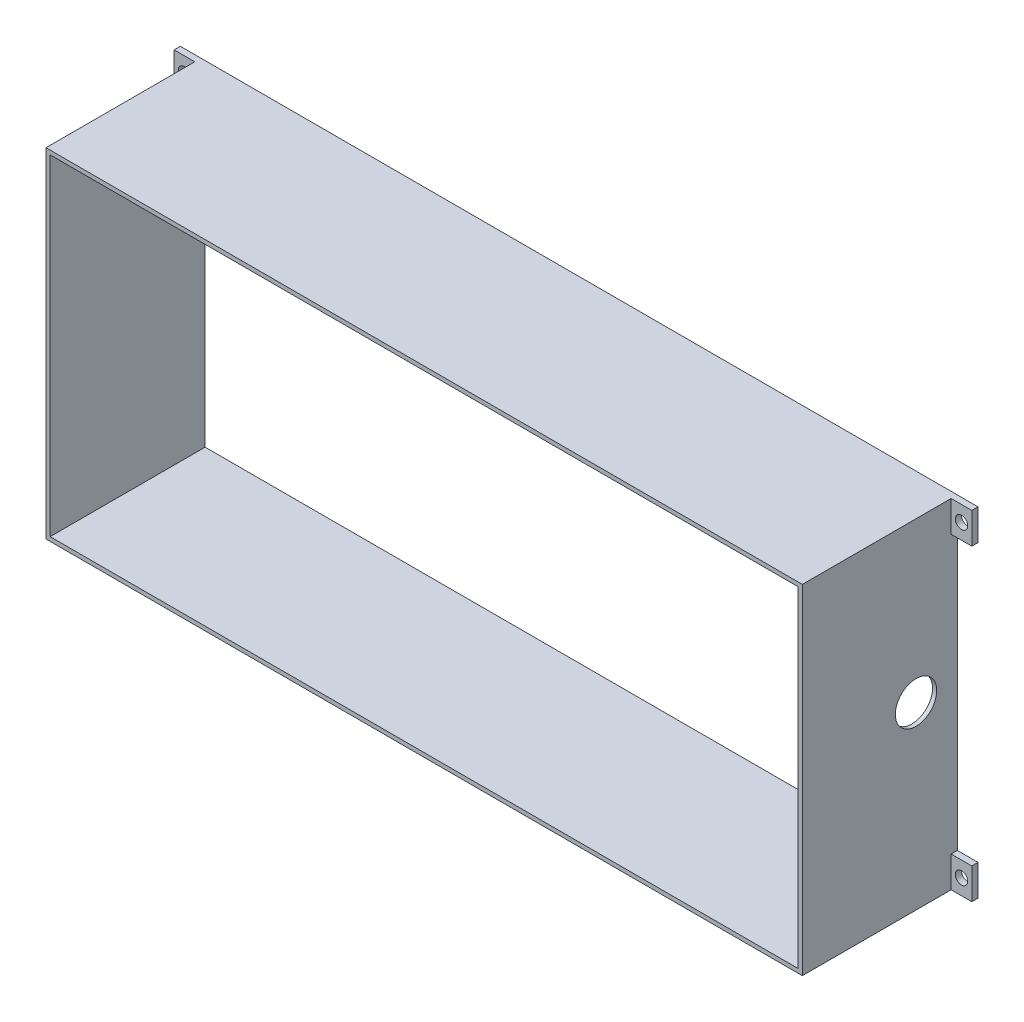
ISO-10303-21;
HEADER;
FILE_DESCRIPTION(('STEP AP214'),'2;1');
FILE_NAME('part.step','',(''),(''),'','','');
FILE_SCHEMA(('AUTOMOTIVE_DESIGN { 1 0 10303 214 1 1 1 1 }'));
ENDSEC;
DATA;
#1=APPLICATION_CONTEXT('core data for automotive mechanical design processes');
#2=APPLICATION_PROTOCOL_DEFINITION('international standard','automotive_design',2000,#1);
#3=PRODUCT_CONTEXT('',#1,'mechanical');
#4=PRODUCT('Part','Part','',(#3));
#5=PRODUCT_RELATED_PRODUCT_CATEGORY('part','',(#4));
#6=PRODUCT_DEFINITION_FORMATION('','',#4);
#7=PRODUCT_DEFINITION_CONTEXT('part definition',#1,'design');
#8=PRODUCT_DEFINITION('design','',#6,#7);
#9=PRODUCT_DEFINITION_SHAPE('','',#8);
#10=(LENGTH_UNIT() NAMED_UNIT(*) SI_UNIT(.MILLI.,.METRE.));
#11=(NAMED_UNIT(*) PLANE_ANGLE_UNIT() SI_UNIT($,.RADIAN.));
#12=(NAMED_UNIT(*) SI_UNIT($,.STERADIAN.) SOLID_ANGLE_UNIT());
#13=UNCERTAINTY_MEASURE_WITH_UNIT(LENGTH_MEASURE(1.E-05),#10,'distance_accuracy_value','');
#14=(GEOMETRIC_REPRESENTATION_CONTEXT(3) GLOBAL_UNCERTAINTY_ASSIGNED_CONTEXT((#13)) GLOBAL_UNIT_ASSIGNED_CONTEXT((#10,
#11,#12)) REPRESENTATION_CONTEXT('',''));
#15=CARTESIAN_POINT('',(0.,0.,0.));
#16=DIRECTION('',(0.,0.,1.));
#17=DIRECTION('',(1.,0.,0.));
#18=AXIS2_PLACEMENT_3D('',#15,#16,#17);
#19=CARTESIAN_POINT('',(183.,82.,75.));
#20=DIRECTION('',(-1.,0.,0.));
#21=DIRECTION('',(0.,-1.,0.));
#22=AXIS2_PLACEMENT_3D('',#19,#20,#21);
#23=PLANE('',#22);
#24=CARTESIAN_POINT('',(183.,5.00000000000004,20.));
#25=DIRECTION('',(1.,0.,0.));
#26=DIRECTION('',(0.,1.,0.));
#27=AXIS2_PLACEMENT_3D('',#24,#25,#26);
#28=CIRCLE('',#27,10.);
#29=CARTESIAN_POINT('',(183.,15.,20.));
#30=VERTEX_POINT('',#29);
#31=EDGE_CURVE('E394',#30,#30,#28,.T.);
#32=ORIENTED_EDGE('',*,*,#31,.F.);
#33=EDGE_LOOP('',(#32));
#34=FACE_BOUND('',#33,.T.);
#35=DIRECTION('',(0.,0.,1.));
#36=VECTOR('',#35,1.);
#37=CARTESIAN_POINT('',(183.,-67.,0.));
#38=LINE('',#37,#36);
#39=CARTESIAN_POINT('',(183.,-67.,0.));
#40=VERTEX_POINT('',#39);
#41=CARTESIAN_POINT('',(183.,-67.,3.00000000000001));
#42=VERTEX_POINT('',#41);
#43=EDGE_CURVE('E239',#40,#42,#38,.T.);
#44=ORIENTED_EDGE('',*,*,#43,.F.);
#45=DIRECTION('',(0.,1.,0.));
#46=VECTOR('',#45,1.);
#47=CARTESIAN_POINT('',(183.,82.,0.));
#48=LINE('',#47,#46);
#49=CARTESIAN_POINT('',(183.,67.,0.));
#50=VERTEX_POINT('',#49);
#51=EDGE_CURVE('E313',#40,#50,#48,.T.);
#52=ORIENTED_EDGE('',*,*,#51,.T.);
#53=DIRECTION('',(0.,0.,-1.));
#54=VECTOR('',#53,1.);
#55=CARTESIAN_POINT('',(183.,67.,0.));
#56=LINE('',#55,#54);
#57=CARTESIAN_POINT('',(183.,67.,3.));
#58=VERTEX_POINT('',#57);
#59=EDGE_CURVE('E263',#58,#50,#56,.T.);
#60=ORIENTED_EDGE('',*,*,#59,.F.);
#61=DIRECTION('',(0.,-1.,0.));
#62=VECTOR('',#61,1.);
#63=CARTESIAN_POINT('',(183.,82.,3.));
#64=LINE('',#63,#62);
#65=CARTESIAN_POINT('',(183.,82.,3.));
#66=VERTEX_POINT('',#65);
#67=EDGE_CURVE('E258',#66,#58,#64,.T.);
#68=ORIENTED_EDGE('',*,*,#67,.F.);
#69=DIRECTION('',(0.,0.,-1.));
#70=VECTOR('',#69,1.);
#71=CARTESIAN_POINT('',(183.,82.,75.));
#72=LINE('',#71,#70);
#73=CARTESIAN_POINT('',(183.,82.,75.));
#74=VERTEX_POINT('',#73);
#75=EDGE_CURVE('E11',#74,#66,#72,.T.);
#76=ORIENTED_EDGE('',*,*,#75,.F.);
#77=DIRECTION('',(0.,1.,0.));
#78=VECTOR('',#77,1.);
#79=CARTESIAN_POINT('',(183.,82.,75.));
#80=LINE('',#79,#78);
#81=CARTESIAN_POINT('',(183.,-82.,75.));
#82=VERTEX_POINT('',#81);
#83=EDGE_CURVE('E185',#82,#74,#80,.T.);
#84=ORIENTED_EDGE('',*,*,#83,.F.);
#85=DIRECTION('',(0.,0.,-1.));
#86=VECTOR('',#85,1.);
#87=CARTESIAN_POINT('',(183.,-82.,75.));
#88=LINE('',#87,#86);
#89=CARTESIAN_POINT('',(183.,-82.,3.));
#90=VERTEX_POINT('',#89);
#91=EDGE_CURVE('E322',#82,#90,#88,.T.);
#92=ORIENTED_EDGE('',*,*,#91,.T.);
#93=DIRECTION('',(0.,-1.,0.));
#94=VECTOR('',#93,1.);
#95=CARTESIAN_POINT('',(183.,-82.,3.));
#96=LINE('',#95,#94);
#97=EDGE_CURVE('E56',#42,#90,#96,.T.);
#98=ORIENTED_EDGE('',*,*,#97,.F.);
#99=EDGE_LOOP('',(#44,#52,#60,#68,#76,#84,#92,#98));
#100=FACE_BOUND('',#99,.T.);
#101=ADVANCED_FACE('F33',(#34,#100),#23,.F.);
#102=CARTESIAN_POINT('',(0.,0.,75.));
#103=DIRECTION('',(0.,0.,1.));
#104=DIRECTION('',(1.,0.,0.));
#105=AXIS2_PLACEMENT_3D('',#102,#103,#104);
#106=PLANE('',#105);
#107=ORIENTED_EDGE('',*,*,#83,.T.);
#108=DIRECTION('',(-1.,0.,0.));
#109=VECTOR('',#108,1.);
#110=CARTESIAN_POINT('',(-183.,82.,75.));
#111=LINE('',#110,#109);
#112=CARTESIAN_POINT('',(-183.,82.,75.));
#113=VERTEX_POINT('',#112);
#114=EDGE_CURVE('E316',#74,#113,#111,.T.);
#115=ORIENTED_EDGE('',*,*,#114,.T.);
#116=DIRECTION('',(0.,-1.,0.));
#117=VECTOR('',#116,1.);
#118=CARTESIAN_POINT('',(-183.,82.,75.));
#119=LINE('',#118,#117);
#120=CARTESIAN_POINT('',(-183.,-82.,75.));
#121=VERTEX_POINT('',#120);
#122=EDGE_CURVE('E318',#113,#121,#119,.T.);
#123=ORIENTED_EDGE('',*,*,#122,.T.);
#124=DIRECTION('',(1.,0.,0.));
#125=VECTOR('',#124,1.);
#126=CARTESIAN_POINT('',(-183.,-82.,75.));
#127=LINE('',#126,#125);
#128=EDGE_CURVE('E320',#121,#82,#127,.T.);
#129=ORIENTED_EDGE('',*,*,#128,.T.);
#130=EDGE_LOOP('',(#107,#115,#123,#129));
#131=FACE_BOUND('',#130,.T.);
#132=DIRECTION('',(-1.,0.,0.));
#133=VECTOR('',#132,1.);
#134=CARTESIAN_POINT('',(-181.,80.,75.));
#135=LINE('',#134,#133);
#136=CARTESIAN_POINT('',(181.,80.,75.));
#137=VERTEX_POINT('',#136);
#138=CARTESIAN_POINT('',(-181.,80.,75.));
#139=VERTEX_POINT('',#138);
#140=EDGE_CURVE('E285',#137,#139,#135,.T.);
#141=ORIENTED_EDGE('',*,*,#140,.F.);
#142=DIRECTION('',(0.,1.,0.));
#143=VECTOR('',#142,1.);
#144=CARTESIAN_POINT('',(181.,80.,75.));
#145=LINE('',#144,#143);
#146=CARTESIAN_POINT('',(181.,-80.,75.));
#147=VERTEX_POINT('',#146);
#148=EDGE_CURVE('E283',#147,#137,#145,.T.);
#149=ORIENTED_EDGE('',*,*,#148,.F.);
#150=DIRECTION('',(1.,0.,0.));
#151=VECTOR('',#150,1.);
#152=CARTESIAN_POINT('',(-181.,-80.,75.));
#153=LINE('',#152,#151);
#154=CARTESIAN_POINT('',(-181.,-80.,75.));
#155=VERTEX_POINT('',#154);
#156=EDGE_CURVE('E291',#155,#147,#153,.T.);
#157=ORIENTED_EDGE('',*,*,#156,.F.);
#158=DIRECTION('',(0.,-1.,0.));
#159=VECTOR('',#158,1.);
#160=CARTESIAN_POINT('',(-181.,80.,75.));
#161=LINE('',#160,#159);
#162=EDGE_CURVE('E288',#139,#155,#161,.T.);
#163=ORIENTED_EDGE('',*,*,#162,.F.);
#164=EDGE_LOOP('',(#141,#149,#157,#163));
#165=FACE_BOUND('',#164,.T.);
#166=ADVANCED_FACE('F357',(#131,#165),#106,.T.);
#167=CARTESIAN_POINT('',(0.,0.,0.));
#168=DIRECTION('',(0.,0.,1.));
#169=DIRECTION('',(1.,0.,0.));
#170=AXIS2_PLACEMENT_3D('',#167,#168,#169);
#171=PLANE('',#170);
#172=CARTESIAN_POINT('',(-188.,74.5,0.));
#173=DIRECTION('',(0.,0.,1.));
#174=DIRECTION('',(1.,0.,0.));
#175=AXIS2_PLACEMENT_3D('',#172,#173,#174);
#176=CIRCLE('',#175,2.99999999999999);
#177=CARTESIAN_POINT('',(-185.,74.5,0.));
#178=VERTEX_POINT('',#177);
#179=EDGE_CURVE('E408',#178,#178,#176,.F.);
#180=ORIENTED_EDGE('',*,*,#179,.F.);
#181=EDGE_LOOP('',(#180));
#182=FACE_BOUND('',#181,.T.);
#183=CARTESIAN_POINT('',(-188.,-74.5,0.));
#184=DIRECTION('',(0.,0.,1.));
#185=DIRECTION('',(1.,0.,0.));
#186=AXIS2_PLACEMENT_3D('',#183,#184,#185);
#187=CIRCLE('',#186,2.99999999999999);
#188=CARTESIAN_POINT('',(-185.,-74.5,0.));
#189=VERTEX_POINT('',#188);
#190=EDGE_CURVE('E403',#189,#189,#187,.F.);
#191=ORIENTED_EDGE('',*,*,#190,.F.);
#192=EDGE_LOOP('',(#191));
#193=FACE_BOUND('',#192,.T.);
#194=CARTESIAN_POINT('',(188.,74.5,0.));
#195=DIRECTION('',(0.,0.,1.));
#196=DIRECTION('',(1.,0.,0.));
#197=AXIS2_PLACEMENT_3D('',#194,#195,#196);
#198=CIRCLE('',#197,2.99999999999999);
#199=CARTESIAN_POINT('',(191.,74.5,0.));
#200=VERTEX_POINT('',#199);
#201=EDGE_CURVE('E211',#200,#200,#198,.T.);
#202=ORIENTED_EDGE('',*,*,#201,.T.);
#203=EDGE_LOOP('',(#202));
#204=FACE_BOUND('',#203,.T.);
#205=CARTESIAN_POINT('',(188.,-74.5,0.));
#206=DIRECTION('',(0.,0.,1.));
#207=DIRECTION('',(1.,0.,0.));
#208=AXIS2_PLACEMENT_3D('',#205,#206,#207);
#209=CIRCLE('',#208,2.99999999999999);
#210=CARTESIAN_POINT('',(191.,-74.5,0.));
#211=VERTEX_POINT('',#210);
#212=EDGE_CURVE('E415',#211,#211,#209,.T.);
#213=ORIENTED_EDGE('',*,*,#212,.T.);
#214=EDGE_LOOP('',(#213));
#215=FACE_BOUND('',#214,.T.);
#216=ORIENTED_EDGE('',*,*,#51,.F.);
#217=DIRECTION('',(-1.,0.,0.));
#218=VECTOR('',#217,1.);
#219=CARTESIAN_POINT('',(193.,-67.,0.));
#220=LINE('',#219,#218);
#221=CARTESIAN_POINT('',(193.,-67.,0.));
#222=VERTEX_POINT('',#221);
#223=EDGE_CURVE('E255',#222,#40,#220,.T.);
#224=ORIENTED_EDGE('',*,*,#223,.F.);
#225=DIRECTION('',(0.,1.,0.));
#226=VECTOR('',#225,1.);
#227=CARTESIAN_POINT('',(193.,-82.,0.));
#228=LINE('',#227,#226);
#229=CARTESIAN_POINT('',(193.,-82.,0.));
#230=VERTEX_POINT('',#229);
#231=EDGE_CURVE('E180',#230,#222,#228,.T.);
#232=ORIENTED_EDGE('',*,*,#231,.F.);
#233=DIRECTION('',(1.,0.,0.));
#234=VECTOR('',#233,1.);
#235=CARTESIAN_POINT('',(-183.,-82.,0.));
#236=LINE('',#235,#234);
#237=CARTESIAN_POINT('',(-193.,-82.,0.));
#238=VERTEX_POINT('',#237);
#239=EDGE_CURVE('E171',#238,#230,#236,.T.);
#240=ORIENTED_EDGE('',*,*,#239,.F.);
#241=DIRECTION('',(0.,1.,0.));
#242=VECTOR('',#241,1.);
#243=CARTESIAN_POINT('',(-193.,-82.,0.));
#244=LINE('',#243,#242);
#245=CARTESIAN_POINT('',(-193.,-67.,0.));
#246=VERTEX_POINT('',#245);
#247=EDGE_CURVE('E176',#238,#246,#244,.T.);
#248=ORIENTED_EDGE('',*,*,#247,.T.);
#249=DIRECTION('',(1.,0.,0.));
#250=VECTOR('',#249,1.);
#251=CARTESIAN_POINT('',(-193.,-67.,0.));
#252=LINE('',#251,#250);
#253=CARTESIAN_POINT('',(-183.,-67.,0.));
#254=VERTEX_POINT('',#253);
#255=EDGE_CURVE('E207',#246,#254,#252,.T.);
#256=ORIENTED_EDGE('',*,*,#255,.T.);
#257=DIRECTION('',(0.,-1.,0.));
#258=VECTOR('',#257,1.);
#259=CARTESIAN_POINT('',(-183.,82.,0.));
#260=LINE('',#259,#258);
#261=CARTESIAN_POINT('',(-183.,67.,0.));
#262=VERTEX_POINT('',#261);
#263=EDGE_CURVE('E186',#262,#254,#260,.T.);
#264=ORIENTED_EDGE('',*,*,#263,.F.);
#265=DIRECTION('',(1.,0.,0.));
#266=VECTOR('',#265,1.);
#267=CARTESIAN_POINT('',(-193.,67.,0.));
#268=LINE('',#267,#266);
#269=CARTESIAN_POINT('',(-193.,67.,0.));
#270=VERTEX_POINT('',#269);
#271=EDGE_CURVE('E48',#270,#262,#268,.T.);
#272=ORIENTED_EDGE('',*,*,#271,.F.);
#273=DIRECTION('',(0.,1.,0.));
#274=VECTOR('',#273,1.);
#275=CARTESIAN_POINT('',(-193.,82.,0.));
#276=LINE('',#275,#274);
#277=CARTESIAN_POINT('',(-193.,82.,0.));
#278=VERTEX_POINT('',#277);
#279=EDGE_CURVE('E219',#270,#278,#276,.T.);
#280=ORIENTED_EDGE('',*,*,#279,.T.);
#281=DIRECTION('',(-1.,0.,0.));
#282=VECTOR('',#281,1.);
#283=CARTESIAN_POINT('',(-183.,82.,0.));
#284=LINE('',#283,#282);
#285=CARTESIAN_POINT('',(193.,82.,0.));
#286=VERTEX_POINT('',#285);
#287=EDGE_CURVE('E324',#286,#278,#284,.T.);
#288=ORIENTED_EDGE('',*,*,#287,.F.);
#289=DIRECTION('',(0.,1.,0.));
#290=VECTOR('',#289,1.);
#291=CARTESIAN_POINT('',(193.,82.,0.));
#292=LINE('',#291,#290);
#293=CARTESIAN_POINT('',(193.,67.,0.));
#294=VERTEX_POINT('',#293);
#295=EDGE_CURVE('E259',#294,#286,#292,.T.);
#296=ORIENTED_EDGE('',*,*,#295,.F.);
#297=DIRECTION('',(-1.,0.,0.));
#298=VECTOR('',#297,1.);
#299=CARTESIAN_POINT('',(193.,67.,0.));
#300=LINE('',#299,#298);
#301=EDGE_CURVE('E269',#294,#50,#300,.T.);
#302=ORIENTED_EDGE('',*,*,#301,.T.);
#303=EDGE_LOOP('',(#216,#224,#232,#240,#248,#256,#264,#272,#280,#288,#296,#302));
#304=FACE_BOUND('',#303,.T.);
#305=DIRECTION('',(0.,1.,0.));
#306=VECTOR('',#305,1.);
#307=CARTESIAN_POINT('',(181.,80.,0.));
#308=LINE('',#307,#306);
#309=CARTESIAN_POINT('',(181.,-80.,0.));
#310=VERTEX_POINT('',#309);
#311=CARTESIAN_POINT('',(181.,80.,0.));
#312=VERTEX_POINT('',#311);
#313=EDGE_CURVE('E282',#310,#312,#308,.T.);
#314=ORIENTED_EDGE('',*,*,#313,.T.);
#315=DIRECTION('',(-1.,0.,0.));
#316=VECTOR('',#315,1.);
#317=CARTESIAN_POINT('',(-181.,80.,0.));
#318=LINE('',#317,#316);
#319=CARTESIAN_POINT('',(-181.,80.,0.));
#320=VERTEX_POINT('',#319);
#321=EDGE_CURVE('E296',#312,#320,#318,.T.);
#322=ORIENTED_EDGE('',*,*,#321,.T.);
#323=DIRECTION('',(0.,-1.,0.));
#324=VECTOR('',#323,1.);
#325=CARTESIAN_POINT('',(-181.,80.,0.));
#326=LINE('',#325,#324);
#327=CARTESIAN_POINT('',(-181.,-80.,0.));
#328=VERTEX_POINT('',#327);
#329=EDGE_CURVE('E299',#320,#328,#326,.T.);
#330=ORIENTED_EDGE('',*,*,#329,.T.);
#331=DIRECTION('',(1.,0.,0.));
#332=VECTOR('',#331,1.);
#333=CARTESIAN_POINT('',(-181.,-80.,0.));
#334=LINE('',#333,#332);
#335=EDGE_CURVE('E286',#328,#310,#334,.T.);
#336=ORIENTED_EDGE('',*,*,#335,.T.);
#337=EDGE_LOOP('',(#314,#322,#330,#336));
#338=FACE_BOUND('',#337,.T.);
#339=ADVANCED_FACE('F174',(#182,#193,#204,#215,#304,#338),#171,.F.);
#340=CARTESIAN_POINT('',(-183.,82.,75.));
#341=DIRECTION('',(0.,-1.,0.));
#342=DIRECTION('',(0.,0.,-1.));
#343=AXIS2_PLACEMENT_3D('',#340,#341,#342);
#344=PLANE('',#343);
#345=ORIENTED_EDGE('',*,*,#287,.T.);
#346=DIRECTION('',(0.,0.,1.));
#347=VECTOR('',#346,1.);
#348=CARTESIAN_POINT('',(-193.,82.,0.));
#349=LINE('',#348,#347);
#350=CARTESIAN_POINT('',(-193.,82.,3.));
#351=VERTEX_POINT('',#350);
#352=EDGE_CURVE('E228',#278,#351,#349,.T.);
#353=ORIENTED_EDGE('',*,*,#352,.T.);
#354=DIRECTION('',(1.,0.,0.));
#355=VECTOR('',#354,1.);
#356=CARTESIAN_POINT('',(-193.,82.,3.));
#357=LINE('',#356,#355);
#358=CARTESIAN_POINT('',(-183.,82.,3.));
#359=VERTEX_POINT('',#358);
#360=EDGE_CURVE('E231',#351,#359,#357,.T.);
#361=ORIENTED_EDGE('',*,*,#360,.T.);
#362=DIRECTION('',(0.,0.,-1.));
#363=VECTOR('',#362,1.);
#364=CARTESIAN_POINT('',(-183.,82.,75.));
#365=LINE('',#364,#363);
#366=EDGE_CURVE('E41',#113,#359,#365,.T.);
#367=ORIENTED_EDGE('',*,*,#366,.F.);
#368=ORIENTED_EDGE('',*,*,#114,.F.);
#369=ORIENTED_EDGE('',*,*,#75,.T.);
#370=DIRECTION('',(-1.,0.,0.));
#371=VECTOR('',#370,1.);
#372=CARTESIAN_POINT('',(193.,82.,3.));
#373=LINE('',#372,#371);
#374=CARTESIAN_POINT('',(193.,82.,3.));
#375=VERTEX_POINT('',#374);
#376=EDGE_CURVE('E279',#375,#66,#373,.T.);
#377=ORIENTED_EDGE('',*,*,#376,.F.);
#378=DIRECTION('',(0.,0.,1.));
#379=VECTOR('',#378,1.);
#380=CARTESIAN_POINT('',(193.,82.,0.));
#381=LINE('',#380,#379);
#382=EDGE_CURVE('E262',#286,#375,#381,.T.);
#383=ORIENTED_EDGE('',*,*,#382,.F.);
#384=EDGE_LOOP('',(#345,#353,#361,#367,#368,#369,#377,#383));
#385=FACE_BOUND('',#384,.T.);
#386=ADVANCED_FACE('F339',(#385),#344,.F.);
#387=CARTESIAN_POINT('',(-183.,82.,75.));
#388=DIRECTION('',(1.,0.,0.));
#389=DIRECTION('',(0.,1.,0.));
#390=AXIS2_PLACEMENT_3D('',#387,#388,#389);
#391=PLANE('',#390);
#392=DIRECTION('',(0.,0.,1.));
#393=VECTOR('',#392,1.);
#394=CARTESIAN_POINT('',(-183.,-67.,0.));
#395=LINE('',#394,#393);
#396=CARTESIAN_POINT('',(-183.,-67.,3.));
#397=VERTEX_POINT('',#396);
#398=EDGE_CURVE('E196',#254,#397,#395,.T.);
#399=ORIENTED_EDGE('',*,*,#398,.T.);
#400=DIRECTION('',(0.,-1.,0.));
#401=VECTOR('',#400,1.);
#402=CARTESIAN_POINT('',(-183.,-82.,3.));
#403=LINE('',#402,#401);
#404=CARTESIAN_POINT('',(-183.,-82.,3.));
#405=VERTEX_POINT('',#404);
#406=EDGE_CURVE('E208',#397,#405,#403,.T.);
#407=ORIENTED_EDGE('',*,*,#406,.T.);
#408=DIRECTION('',(0.,0.,-1.));
#409=VECTOR('',#408,1.);
#410=CARTESIAN_POINT('',(-183.,-82.,75.));
#411=LINE('',#410,#409);
#412=EDGE_CURVE('E329',#121,#405,#411,.T.);
#413=ORIENTED_EDGE('',*,*,#412,.F.);
#414=ORIENTED_EDGE('',*,*,#122,.F.);
#415=ORIENTED_EDGE('',*,*,#366,.T.);
#416=DIRECTION('',(0.,-1.,0.));
#417=VECTOR('',#416,1.);
#418=CARTESIAN_POINT('',(-183.,82.,3.));
#419=LINE('',#418,#417);
#420=CARTESIAN_POINT('',(-183.,67.,3.));
#421=VERTEX_POINT('',#420);
#422=EDGE_CURVE('E223',#359,#421,#419,.T.);
#423=ORIENTED_EDGE('',*,*,#422,.T.);
#424=DIRECTION('',(0.,0.,-1.));
#425=VECTOR('',#424,1.);
#426=CARTESIAN_POINT('',(-183.,67.,0.));
#427=LINE('',#426,#425);
#428=EDGE_CURVE('E218',#421,#262,#427,.T.);
#429=ORIENTED_EDGE('',*,*,#428,.T.);
#430=ORIENTED_EDGE('',*,*,#263,.T.);
#431=EDGE_LOOP('',(#399,#407,#413,#414,#415,#423,#429,#430));
#432=FACE_BOUND('',#431,.T.);
#433=ADVANCED_FACE('F335',(#432),#391,.F.);
#434=CARTESIAN_POINT('',(-183.,-82.,75.));
#435=DIRECTION('',(0.,1.,0.));
#436=DIRECTION('',(0.,0.,1.));
#437=AXIS2_PLACEMENT_3D('',#434,#435,#436);
#438=PLANE('',#437);
#439=ORIENTED_EDGE('',*,*,#239,.T.);
#440=DIRECTION('',(0.,0.,-1.));
#441=VECTOR('',#440,1.);
#442=CARTESIAN_POINT('',(193.,-82.,0.));
#443=LINE('',#442,#441);
#444=CARTESIAN_POINT('',(193.,-82.,3.));
#445=VERTEX_POINT('',#444);
#446=EDGE_CURVE('E245',#445,#230,#443,.T.);
#447=ORIENTED_EDGE('',*,*,#446,.F.);
#448=DIRECTION('',(-1.,0.,0.));
#449=VECTOR('',#448,1.);
#450=CARTESIAN_POINT('',(193.,-82.,3.));
#451=LINE('',#450,#449);
#452=EDGE_CURVE('E247',#445,#90,#451,.T.);
#453=ORIENTED_EDGE('',*,*,#452,.T.);
#454=ORIENTED_EDGE('',*,*,#91,.F.);
#455=ORIENTED_EDGE('',*,*,#128,.F.);
#456=ORIENTED_EDGE('',*,*,#412,.T.);
#457=DIRECTION('',(1.,0.,0.));
#458=VECTOR('',#457,1.);
#459=CARTESIAN_POINT('',(-193.,-82.,3.));
#460=LINE('',#459,#458);
#461=CARTESIAN_POINT('',(-193.,-82.,3.));
#462=VERTEX_POINT('',#461);
#463=EDGE_CURVE('E200',#462,#405,#460,.T.);
#464=ORIENTED_EDGE('',*,*,#463,.F.);
#465=DIRECTION('',(0.,0.,-1.));
#466=VECTOR('',#465,1.);
#467=CARTESIAN_POINT('',(-193.,-82.,0.));
#468=LINE('',#467,#466);
#469=EDGE_CURVE('E192',#462,#238,#468,.T.);
#470=ORIENTED_EDGE('',*,*,#469,.T.);
#471=EDGE_LOOP('',(#439,#447,#453,#454,#455,#456,#464,#470));
#472=FACE_BOUND('',#471,.T.);
#473=ADVANCED_FACE('F198',(#472),#438,.F.);
#474=CARTESIAN_POINT('',(181.,80.,75.));
#475=DIRECTION('',(-1.,0.,0.));
#476=DIRECTION('',(0.,0.,1.));
#477=AXIS2_PLACEMENT_3D('',#474,#475,#476);
#478=PLANE('',#477);
#479=CARTESIAN_POINT('',(181.,5.00000000000004,20.));
#480=DIRECTION('',(-1.,0.,0.));
#481=DIRECTION('',(0.,0.,1.));
#482=AXIS2_PLACEMENT_3D('',#479,#480,#481);
#483=CIRCLE('',#482,10.);
#484=CARTESIAN_POINT('',(181.,5.00000000000004,30.));
#485=VERTEX_POINT('',#484);
#486=EDGE_CURVE('E36',#485,#485,#483,.T.);
#487=ORIENTED_EDGE('',*,*,#486,.F.);
#488=EDGE_LOOP('',(#487));
#489=FACE_BOUND('',#488,.T.);
#490=ORIENTED_EDGE('',*,*,#313,.F.);
#491=DIRECTION('',(0.,0.,-1.));
#492=VECTOR('',#491,1.);
#493=CARTESIAN_POINT('',(181.,-80.,75.));
#494=LINE('',#493,#492);
#495=EDGE_CURVE('E293',#147,#310,#494,.T.);
#496=ORIENTED_EDGE('',*,*,#495,.F.);
#497=ORIENTED_EDGE('',*,*,#148,.T.);
#498=DIRECTION('',(0.,0.,-1.));
#499=VECTOR('',#498,1.);
#500=CARTESIAN_POINT('',(181.,80.,75.));
#501=LINE('',#500,#499);
#502=EDGE_CURVE('E310',#137,#312,#501,.T.);
#503=ORIENTED_EDGE('',*,*,#502,.T.);
#504=EDGE_LOOP('',(#490,#496,#497,#503));
#505=FACE_BOUND('',#504,.T.);
#506=ADVANCED_FACE('F518',(#489,#505),#478,.T.);
#507=CARTESIAN_POINT('',(-181.,80.,75.));
#508=DIRECTION('',(0.,-1.,0.));
#509=DIRECTION('',(0.,0.,-1.));
#510=AXIS2_PLACEMENT_3D('',#507,#508,#509);
#511=PLANE('',#510);
#512=ORIENTED_EDGE('',*,*,#321,.F.);
#513=ORIENTED_EDGE('',*,*,#502,.F.);
#514=ORIENTED_EDGE('',*,*,#140,.T.);
#515=DIRECTION('',(0.,0.,-1.));
#516=VECTOR('',#515,1.);
#517=CARTESIAN_POINT('',(-181.,80.,75.));
#518=LINE('',#517,#516);
#519=EDGE_CURVE('E308',#139,#320,#518,.T.);
#520=ORIENTED_EDGE('',*,*,#519,.T.);
#521=EDGE_LOOP('',(#512,#513,#514,#520));
#522=FACE_BOUND('',#521,.T.);
#523=ADVANCED_FACE('F521',(#522),#511,.T.);
#524=CARTESIAN_POINT('',(-181.,80.,75.));
#525=DIRECTION('',(1.,0.,0.));
#526=DIRECTION('',(0.,1.,0.));
#527=AXIS2_PLACEMENT_3D('',#524,#525,#526);
#528=PLANE('',#527);
#529=ORIENTED_EDGE('',*,*,#329,.F.);
#530=ORIENTED_EDGE('',*,*,#519,.F.);
#531=ORIENTED_EDGE('',*,*,#162,.T.);
#532=DIRECTION('',(0.,0.,-1.));
#533=VECTOR('',#532,1.);
#534=CARTESIAN_POINT('',(-181.,-80.,75.));
#535=LINE('',#534,#533);
#536=EDGE_CURVE('E306',#155,#328,#535,.T.);
#537=ORIENTED_EDGE('',*,*,#536,.T.);
#538=EDGE_LOOP('',(#529,#530,#531,#537));
#539=FACE_BOUND('',#538,.T.);
#540=ADVANCED_FACE('F538',(#539),#528,.T.);
#541=CARTESIAN_POINT('',(-181.,-80.,75.));
#542=DIRECTION('',(0.,1.,0.));
#543=DIRECTION('',(0.,0.,1.));
#544=AXIS2_PLACEMENT_3D('',#541,#542,#543);
#545=PLANE('',#544);
#546=ORIENTED_EDGE('',*,*,#335,.F.);
#547=ORIENTED_EDGE('',*,*,#536,.F.);
#548=ORIENTED_EDGE('',*,*,#156,.T.);
#549=ORIENTED_EDGE('',*,*,#495,.T.);
#550=EDGE_LOOP('',(#546,#547,#548,#549));
#551=FACE_BOUND('',#550,.T.);
#552=ADVANCED_FACE('F546',(#551),#545,.T.);
#553=CARTESIAN_POINT('',(193.,82.,3.));
#554=DIRECTION('',(0.,0.,-1.));
#555=DIRECTION('',(0.,1.,0.));
#556=AXIS2_PLACEMENT_3D('',#553,#554,#555);
#557=PLANE('',#556);
#558=CARTESIAN_POINT('',(188.,74.5,2.99999999999999));
#559=DIRECTION('',(0.,0.,1.));
#560=DIRECTION('',(1.,0.,0.));
#561=AXIS2_PLACEMENT_3D('',#558,#559,#560);
#562=CIRCLE('',#561,2.99999999999999);
#563=CARTESIAN_POINT('',(191.,74.5,2.99999999999999));
#564=VERTEX_POINT('',#563);
#565=EDGE_CURVE('E412',#564,#564,#562,.T.);
#566=ORIENTED_EDGE('',*,*,#565,.F.);
#567=EDGE_LOOP('',(#566));
#568=FACE_BOUND('',#567,.T.);
#569=ORIENTED_EDGE('',*,*,#67,.T.);
#570=DIRECTION('',(-1.,0.,0.));
#571=VECTOR('',#570,1.);
#572=CARTESIAN_POINT('',(193.,67.,3.));
#573=LINE('',#572,#571);
#574=CARTESIAN_POINT('',(193.,67.,3.));
#575=VERTEX_POINT('',#574);
#576=EDGE_CURVE('E276',#575,#58,#573,.T.);
#577=ORIENTED_EDGE('',*,*,#576,.F.);
#578=DIRECTION('',(0.,-1.,0.));
#579=VECTOR('',#578,1.);
#580=CARTESIAN_POINT('',(193.,82.,3.));
#581=LINE('',#580,#579);
#582=EDGE_CURVE('E265',#375,#575,#581,.T.);
#583=ORIENTED_EDGE('',*,*,#582,.F.);
#584=ORIENTED_EDGE('',*,*,#376,.T.);
#585=EDGE_LOOP('',(#569,#577,#583,#584));
#586=FACE_BOUND('',#585,.T.);
#587=ADVANCED_FACE('F364',(#568,#586),#557,.F.);
#588=CARTESIAN_POINT('',(193.,67.,0.));
#589=DIRECTION('',(0.,1.,0.));
#590=DIRECTION('',(-1.,0.,0.));
#591=AXIS2_PLACEMENT_3D('',#588,#589,#590);
#592=PLANE('',#591);
#593=ORIENTED_EDGE('',*,*,#59,.T.);
#594=ORIENTED_EDGE('',*,*,#301,.F.);
#595=DIRECTION('',(0.,0.,-1.));
#596=VECTOR('',#595,1.);
#597=CARTESIAN_POINT('',(193.,67.,0.));
#598=LINE('',#597,#596);
#599=EDGE_CURVE('E267',#575,#294,#598,.T.);
#600=ORIENTED_EDGE('',*,*,#599,.F.);
#601=ORIENTED_EDGE('',*,*,#576,.T.);
#602=EDGE_LOOP('',(#593,#594,#600,#601));
#603=FACE_BOUND('',#602,.T.);
#604=ADVANCED_FACE('F561',(#603),#592,.F.);
#605=CARTESIAN_POINT('',(193.,0.,0.));
#606=DIRECTION('',(-1.,0.,0.));
#607=DIRECTION('',(0.,0.,1.));
#608=AXIS2_PLACEMENT_3D('',#605,#606,#607);
#609=PLANE('',#608);
#610=ORIENTED_EDGE('',*,*,#295,.T.);
#611=ORIENTED_EDGE('',*,*,#382,.T.);
#612=ORIENTED_EDGE('',*,*,#582,.T.);
#613=ORIENTED_EDGE('',*,*,#599,.T.);
#614=EDGE_LOOP('',(#610,#611,#612,#613));
#615=FACE_BOUND('',#614,.T.);
#616=ADVANCED_FACE('F368',(#615),#609,.F.);
#617=CARTESIAN_POINT('',(193.,-67.,0.));
#618=DIRECTION('',(0.,-1.,0.));
#619=DIRECTION('',(1.,0.,0.));
#620=AXIS2_PLACEMENT_3D('',#617,#618,#619);
#621=PLANE('',#620);
#622=ORIENTED_EDGE('',*,*,#43,.T.);
#623=DIRECTION('',(-1.,0.,0.));
#624=VECTOR('',#623,1.);
#625=CARTESIAN_POINT('',(193.,-67.,3.));
#626=LINE('',#625,#624);
#627=CARTESIAN_POINT('',(193.,-67.,3.));
#628=VERTEX_POINT('',#627);
#629=EDGE_CURVE('E252',#628,#42,#626,.T.);
#630=ORIENTED_EDGE('',*,*,#629,.F.);
#631=DIRECTION('',(0.,0.,1.));
#632=VECTOR('',#631,1.);
#633=CARTESIAN_POINT('',(193.,-67.,0.));
#634=LINE('',#633,#632);
#635=EDGE_CURVE('E241',#222,#628,#634,.T.);
#636=ORIENTED_EDGE('',*,*,#635,.F.);
#637=ORIENTED_EDGE('',*,*,#223,.T.);
#638=EDGE_LOOP('',(#622,#630,#636,#637));
#639=FACE_BOUND('',#638,.T.);
#640=ADVANCED_FACE('F575',(#639),#621,.F.);
#641=CARTESIAN_POINT('',(193.,-82.,3.));
#642=DIRECTION('',(0.,0.,-1.));
#643=DIRECTION('',(0.,1.,0.));
#644=AXIS2_PLACEMENT_3D('',#641,#642,#643);
#645=PLANE('',#644);
#646=CARTESIAN_POINT('',(188.,-74.5,2.99999999999999));
#647=DIRECTION('',(0.,0.,1.));
#648=DIRECTION('',(1.,0.,0.));
#649=AXIS2_PLACEMENT_3D('',#646,#647,#648);
#650=CIRCLE('',#649,2.99999999999999);
#651=CARTESIAN_POINT('',(191.,-74.5,2.99999999999999));
#652=VERTEX_POINT('',#651);
#653=EDGE_CURVE('E411',#652,#652,#650,.T.);
#654=ORIENTED_EDGE('',*,*,#653,.F.);
#655=EDGE_LOOP('',(#654));
#656=FACE_BOUND('',#655,.T.);
#657=ORIENTED_EDGE('',*,*,#97,.T.);
#658=ORIENTED_EDGE('',*,*,#452,.F.);
#659=DIRECTION('',(0.,-1.,0.));
#660=VECTOR('',#659,1.);
#661=CARTESIAN_POINT('',(193.,-82.,3.));
#662=LINE('',#661,#660);
#663=EDGE_CURVE('E243',#628,#445,#662,.T.);
#664=ORIENTED_EDGE('',*,*,#663,.F.);
#665=ORIENTED_EDGE('',*,*,#629,.T.);
#666=EDGE_LOOP('',(#657,#658,#664,#665));
#667=FACE_BOUND('',#666,.T.);
#668=ADVANCED_FACE('F463',(#656,#667),#645,.F.);
#669=CARTESIAN_POINT('',(193.,0.,0.));
#670=DIRECTION('',(1.,0.,0.));
#671=DIRECTION('',(0.,0.,-1.));
#672=AXIS2_PLACEMENT_3D('',#669,#670,#671);
#673=PLANE('',#672);
#674=ORIENTED_EDGE('',*,*,#231,.T.);
#675=ORIENTED_EDGE('',*,*,#635,.T.);
#676=ORIENTED_EDGE('',*,*,#663,.T.);
#677=ORIENTED_EDGE('',*,*,#446,.T.);
#678=EDGE_LOOP('',(#674,#675,#676,#677));
#679=FACE_BOUND('',#678,.T.);
#680=ADVANCED_FACE('F588',(#679),#673,.T.);
#681=CARTESIAN_POINT('',(-193.,67.,0.));
#682=DIRECTION('',(0.,-1.,0.));
#683=DIRECTION('',(1.,0.,0.));
#684=AXIS2_PLACEMENT_3D('',#681,#682,#683);
#685=PLANE('',#684);
#686=ORIENTED_EDGE('',*,*,#428,.F.);
#687=DIRECTION('',(1.,0.,0.));
#688=VECTOR('',#687,1.);
#689=CARTESIAN_POINT('',(-193.,67.,3.));
#690=LINE('',#689,#688);
#691=CARTESIAN_POINT('',(-193.,67.,3.));
#692=VERTEX_POINT('',#691);
#693=EDGE_CURVE('E236',#692,#421,#690,.T.);
#694=ORIENTED_EDGE('',*,*,#693,.F.);
#695=DIRECTION('',(0.,0.,-1.));
#696=VECTOR('',#695,1.);
#697=CARTESIAN_POINT('',(-193.,67.,0.));
#698=LINE('',#697,#696);
#699=EDGE_CURVE('E222',#692,#270,#698,.T.);
#700=ORIENTED_EDGE('',*,*,#699,.T.);
#701=ORIENTED_EDGE('',*,*,#271,.T.);
#702=EDGE_LOOP('',(#686,#694,#700,#701));
#703=FACE_BOUND('',#702,.T.);
#704=ADVANCED_FACE('F345',(#703),#685,.T.);
#705=CARTESIAN_POINT('',(-193.,82.,3.));
#706=DIRECTION('',(0.,0.,1.));
#707=DIRECTION('',(0.,-1.,0.));
#708=AXIS2_PLACEMENT_3D('',#705,#706,#707);
#709=PLANE('',#708);
#710=CARTESIAN_POINT('',(-188.,74.5,2.99999999999999));
#711=DIRECTION('',(0.,0.,-1.));
#712=DIRECTION('',(-1.,0.,0.));
#713=AXIS2_PLACEMENT_3D('',#710,#711,#712);
#714=CIRCLE('',#713,2.99999999999999);
#715=CARTESIAN_POINT('',(-191.,74.5,2.99999999999999));
#716=VERTEX_POINT('',#715);
#717=EDGE_CURVE('E400',#716,#716,#714,.T.);
#718=ORIENTED_EDGE('',*,*,#717,.T.);
#719=EDGE_LOOP('',(#718));
#720=FACE_BOUND('',#719,.T.);
#721=ORIENTED_EDGE('',*,*,#422,.F.);
#722=ORIENTED_EDGE('',*,*,#360,.F.);
#723=DIRECTION('',(0.,-1.,0.));
#724=VECTOR('',#723,1.);
#725=CARTESIAN_POINT('',(-193.,82.,3.));
#726=LINE('',#725,#724);
#727=EDGE_CURVE('E225',#351,#692,#726,.T.);
#728=ORIENTED_EDGE('',*,*,#727,.T.);
#729=ORIENTED_EDGE('',*,*,#693,.T.);
#730=EDGE_LOOP('',(#721,#722,#728,#729));
#731=FACE_BOUND('',#730,.T.);
#732=ADVANCED_FACE('F343',(#720,#731),#709,.T.);
#733=CARTESIAN_POINT('',(-193.,0.,0.));
#734=DIRECTION('',(1.,0.,0.));
#735=DIRECTION('',(0.,0.,1.));
#736=AXIS2_PLACEMENT_3D('',#733,#734,#735);
#737=PLANE('',#736);
#738=ORIENTED_EDGE('',*,*,#279,.F.);
#739=ORIENTED_EDGE('',*,*,#699,.F.);
#740=ORIENTED_EDGE('',*,*,#727,.F.);
#741=ORIENTED_EDGE('',*,*,#352,.F.);
#742=EDGE_LOOP('',(#738,#739,#740,#741));
#743=FACE_BOUND('',#742,.T.);
#744=ADVANCED_FACE('F372',(#743),#737,.F.);
#745=CARTESIAN_POINT('',(-193.,-82.,3.));
#746=DIRECTION('',(0.,0.,1.));
#747=DIRECTION('',(0.,-1.,0.));
#748=AXIS2_PLACEMENT_3D('',#745,#746,#747);
#749=PLANE('',#748);
#750=CARTESIAN_POINT('',(-188.,-74.5,2.99999999999999));
#751=DIRECTION('',(0.,0.,-1.));
#752=DIRECTION('',(-1.,0.,0.));
#753=AXIS2_PLACEMENT_3D('',#750,#751,#752);
#754=CIRCLE('',#753,2.99999999999999);
#755=CARTESIAN_POINT('',(-191.,-74.5,2.99999999999999));
#756=VERTEX_POINT('',#755);
#757=EDGE_CURVE('E398',#756,#756,#754,.T.);
#758=ORIENTED_EDGE('',*,*,#757,.T.);
#759=EDGE_LOOP('',(#758));
#760=FACE_BOUND('',#759,.T.);
#761=ORIENTED_EDGE('',*,*,#406,.F.);
#762=DIRECTION('',(1.,0.,0.));
#763=VECTOR('',#762,1.);
#764=CARTESIAN_POINT('',(-193.,-67.,3.));
#765=LINE('',#764,#763);
#766=CARTESIAN_POINT('',(-193.,-67.,3.));
#767=VERTEX_POINT('',#766);
#768=EDGE_CURVE('E215',#767,#397,#765,.T.);
#769=ORIENTED_EDGE('',*,*,#768,.F.);
#770=DIRECTION('',(0.,-1.,0.));
#771=VECTOR('',#770,1.);
#772=CARTESIAN_POINT('',(-193.,-82.,3.));
#773=LINE('',#772,#771);
#774=EDGE_CURVE('E201',#767,#462,#773,.T.);
#775=ORIENTED_EDGE('',*,*,#774,.T.);
#776=ORIENTED_EDGE('',*,*,#463,.T.);
#777=EDGE_LOOP('',(#761,#769,#775,#776));
#778=FACE_BOUND('',#777,.T.);
#779=ADVANCED_FACE('F374',(#760,#778),#749,.T.);
#780=CARTESIAN_POINT('',(-193.,-67.,0.));
#781=DIRECTION('',(0.,1.,0.));
#782=DIRECTION('',(-1.,0.,0.));
#783=AXIS2_PLACEMENT_3D('',#780,#781,#782);
#784=PLANE('',#783);
#785=ORIENTED_EDGE('',*,*,#398,.F.);
#786=ORIENTED_EDGE('',*,*,#255,.F.);
#787=DIRECTION('',(0.,0.,1.));
#788=VECTOR('',#787,1.);
#789=CARTESIAN_POINT('',(-193.,-67.,0.));
#790=LINE('',#789,#788);
#791=EDGE_CURVE('E195',#246,#767,#790,.T.);
#792=ORIENTED_EDGE('',*,*,#791,.T.);
#793=ORIENTED_EDGE('',*,*,#768,.T.);
#794=EDGE_LOOP('',(#785,#786,#792,#793));
#795=FACE_BOUND('',#794,.T.);
#796=ADVANCED_FACE('F350',(#795),#784,.T.);
#797=CARTESIAN_POINT('',(-193.,0.,0.));
#798=DIRECTION('',(-1.,0.,0.));
#799=DIRECTION('',(0.,0.,-1.));
#800=AXIS2_PLACEMENT_3D('',#797,#798,#799);
#801=PLANE('',#800);
#802=ORIENTED_EDGE('',*,*,#247,.F.);
#803=ORIENTED_EDGE('',*,*,#469,.F.);
#804=ORIENTED_EDGE('',*,*,#774,.F.);
#805=ORIENTED_EDGE('',*,*,#791,.F.);
#806=EDGE_LOOP('',(#802,#803,#804,#805));
#807=FACE_BOUND('',#806,.T.);
#808=ADVANCED_FACE('F190',(#807),#801,.T.);
#809=CARTESIAN_POINT('',(188.,-74.5,-7.00000000000001));
#810=DIRECTION('',(0.,0.,1.));
#811=DIRECTION('',(1.,0.,0.));
#812=AXIS2_PLACEMENT_3D('',#809,#810,#811);
#813=CYLINDRICAL_SURFACE('',#812,2.99999999999999);
#814=ORIENTED_EDGE('',*,*,#653,.T.);
#815=EDGE_LOOP('',(#814));
#816=FACE_BOUND('',#815,.T.);
#817=ORIENTED_EDGE('',*,*,#212,.F.);
#818=EDGE_LOOP('',(#817));
#819=FACE_BOUND('',#818,.T.);
#820=ADVANCED_FACE('F427',(#816,#819),#813,.F.);
#821=CARTESIAN_POINT('',(188.,74.5,-7.00000000000001));
#822=DIRECTION('',(0.,0.,1.));
#823=DIRECTION('',(1.,0.,0.));
#824=AXIS2_PLACEMENT_3D('',#821,#822,#823);
#825=CYLINDRICAL_SURFACE('',#824,2.99999999999999);
#826=ORIENTED_EDGE('',*,*,#565,.T.);
#827=EDGE_LOOP('',(#826));
#828=FACE_BOUND('',#827,.T.);
#829=ORIENTED_EDGE('',*,*,#201,.F.);
#830=EDGE_LOOP('',(#829));
#831=FACE_BOUND('',#830,.T.);
#832=ADVANCED_FACE('F424',(#828,#831),#825,.F.);
#833=CARTESIAN_POINT('',(-188.,-74.5,-7.00000000000001));
#834=DIRECTION('',(0.,0.,1.));
#835=DIRECTION('',(1.,0.,0.));
#836=AXIS2_PLACEMENT_3D('',#833,#834,#835);
#837=CYLINDRICAL_SURFACE('',#836,2.99999999999999);
#838=ORIENTED_EDGE('',*,*,#757,.F.);
#839=EDGE_LOOP('',(#838));
#840=FACE_BOUND('',#839,.T.);
#841=ORIENTED_EDGE('',*,*,#190,.T.);
#842=EDGE_LOOP('',(#841));
#843=FACE_BOUND('',#842,.T.);
#844=ADVANCED_FACE('F426',(#840,#843),#837,.F.);
#845=CARTESIAN_POINT('',(-188.,74.5,-7.00000000000001));
#846=DIRECTION('',(0.,0.,1.));
#847=DIRECTION('',(1.,0.,0.));
#848=AXIS2_PLACEMENT_3D('',#845,#846,#847);
#849=CYLINDRICAL_SURFACE('',#848,2.99999999999999);
#850=ORIENTED_EDGE('',*,*,#717,.F.);
#851=EDGE_LOOP('',(#850));
#852=FACE_BOUND('',#851,.T.);
#853=ORIENTED_EDGE('',*,*,#179,.T.);
#854=EDGE_LOOP('',(#853));
#855=FACE_BOUND('',#854,.T.);
#856=ADVANCED_FACE('F434',(#852,#855),#849,.F.);
#857=CARTESIAN_POINT('',(173.,5.00000000000003,20.));
#858=DIRECTION('',(1.,0.,0.));
#859=DIRECTION('',(0.,1.,0.));
#860=AXIS2_PLACEMENT_3D('',#857,#858,#859);
#861=CYLINDRICAL_SURFACE('',#860,10.);
#862=ORIENTED_EDGE('',*,*,#486,.T.);
#863=EDGE_LOOP('',(#862));
#864=FACE_BOUND('',#863,.T.);
#865=ORIENTED_EDGE('',*,*,#31,.T.);
#866=EDGE_LOOP('',(#865));
#867=FACE_BOUND('',#866,.T.);
#868=ADVANCED_FACE('F504',(#864,#867),#861,.F.);
#869=CLOSED_SHELL('',(#101,#166,#339,#386,#433,#473,#506,#523,#540,#552,#587,#604,#616,#640,
#668,#680,#704,#732,#744,#779,#796,#808,#820,#832,#844,#856,#868));
#870=MANIFOLD_SOLID_BREP('B2',#869);
#871=ADVANCED_BREP_SHAPE_REPRESENTATION('',(#18,#870),#14);
#872=SHAPE_DEFINITION_REPRESENTATION(#9,#871);
ENDSEC;
END-ISO-10303-21;
